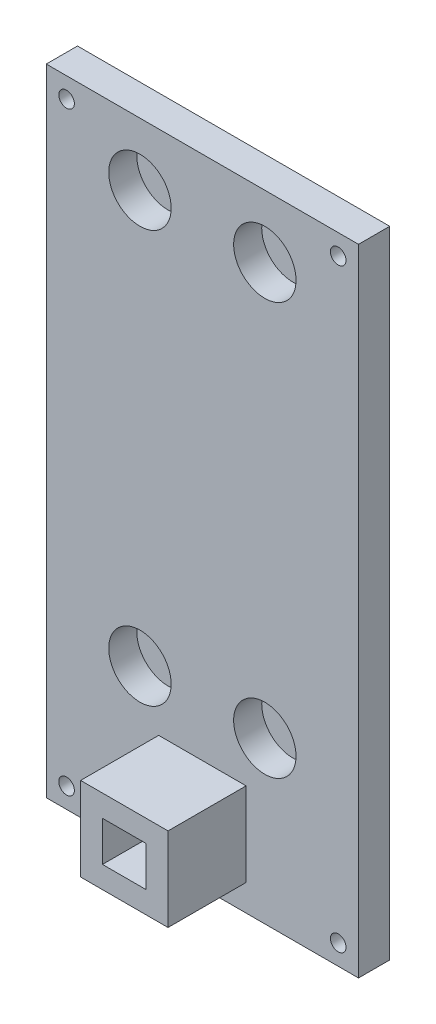
ISO-10303-21;
HEADER;
FILE_DESCRIPTION(('STEP AP214'),'2;1');
FILE_NAME('part.step','',(''),(''),'','','');
FILE_SCHEMA(('AUTOMOTIVE_DESIGN { 1 0 10303 214 1 1 1 1 }'));
ENDSEC;
DATA;
#1=APPLICATION_CONTEXT('core data for automotive mechanical design processes');
#2=APPLICATION_PROTOCOL_DEFINITION('international standard','automotive_design',2000,#1);
#3=PRODUCT_CONTEXT('',#1,'mechanical');
#4=PRODUCT('Part','Part','',(#3));
#5=PRODUCT_RELATED_PRODUCT_CATEGORY('part','',(#4));
#6=PRODUCT_DEFINITION_FORMATION('','',#4);
#7=PRODUCT_DEFINITION_CONTEXT('part definition',#1,'design');
#8=PRODUCT_DEFINITION('design','',#6,#7);
#9=PRODUCT_DEFINITION_SHAPE('','',#8);
#10=(LENGTH_UNIT() NAMED_UNIT(*) SI_UNIT(.MILLI.,.METRE.));
#11=(NAMED_UNIT(*) PLANE_ANGLE_UNIT() SI_UNIT($,.RADIAN.));
#12=(NAMED_UNIT(*) SI_UNIT($,.STERADIAN.) SOLID_ANGLE_UNIT());
#13=UNCERTAINTY_MEASURE_WITH_UNIT(LENGTH_MEASURE(1.E-05),#10,'distance_accuracy_value','');
#14=(GEOMETRIC_REPRESENTATION_CONTEXT(3) GLOBAL_UNCERTAINTY_ASSIGNED_CONTEXT((#13)) GLOBAL_UNIT_ASSIGNED_CONTEXT((#10,
#11,#12)) REPRESENTATION_CONTEXT('',''));
#15=CARTESIAN_POINT('',(0.,0.,0.));
#16=DIRECTION('',(0.,0.,1.));
#17=DIRECTION('',(1.,0.,0.));
#18=AXIS2_PLACEMENT_3D('',#15,#16,#17);
#19=CARTESIAN_POINT('',(0.,0.,10.));
#20=DIRECTION('',(0.,0.,1.));
#21=DIRECTION('',(1.,0.,0.));
#22=AXIS2_PLACEMENT_3D('',#19,#20,#21);
#23=PLANE('',#22);
#24=CARTESIAN_POINT('',(93.5,243.5,10.));
#25=DIRECTION('',(0.,0.,1.));
#26=DIRECTION('',(1.,0.,0.));
#27=AXIS2_PLACEMENT_3D('',#24,#25,#26);
#28=CIRCLE('',#27,2.50000000000001);
#29=CARTESIAN_POINT('',(96.,243.5,10.));
#30=VERTEX_POINT('',#29);
#31=EDGE_CURVE('E643',#30,#30,#28,.T.);
#32=ORIENTED_EDGE('',*,*,#31,.F.);
#33=EDGE_LOOP('',(#32));
#34=FACE_BOUND('',#33,.T.);
#35=CARTESIAN_POINT('',(6.49999999999999,53.,10.));
#36=DIRECTION('',(0.,0.,1.));
#37=DIRECTION('',(1.,0.,0.));
#38=AXIS2_PLACEMENT_3D('',#35,#36,#37);
#39=CIRCLE('',#38,2.5);
#40=CARTESIAN_POINT('',(8.99999999999999,53.,10.));
#41=VERTEX_POINT('',#40);
#42=EDGE_CURVE('E651',#41,#41,#39,.T.);
#43=ORIENTED_EDGE('',*,*,#42,.F.);
#44=EDGE_LOOP('',(#43));
#45=FACE_BOUND('',#44,.T.);
#46=CARTESIAN_POINT('',(93.5,53.,10.));
#47=DIRECTION('',(0.,0.,1.));
#48=DIRECTION('',(1.,0.,0.));
#49=AXIS2_PLACEMENT_3D('',#46,#47,#48);
#50=CIRCLE('',#49,2.50000000000001);
#51=CARTESIAN_POINT('',(96.,53.,10.));
#52=VERTEX_POINT('',#51);
#53=EDGE_CURVE('E659',#52,#52,#50,.T.);
#54=ORIENTED_EDGE('',*,*,#53,.F.);
#55=EDGE_LOOP('',(#54));
#56=FACE_BOUND('',#55,.T.);
#57=CARTESIAN_POINT('',(6.49999999999999,243.5,10.));
#58=DIRECTION('',(0.,0.,1.));
#59=DIRECTION('',(1.,0.,0.));
#60=AXIS2_PLACEMENT_3D('',#57,#58,#59);
#61=CIRCLE('',#60,2.5);
#62=CARTESIAN_POINT('',(8.99999999999999,243.5,10.));
#63=VERTEX_POINT('',#62);
#64=EDGE_CURVE('E645',#63,#63,#61,.T.);
#65=ORIENTED_EDGE('',*,*,#64,.F.);
#66=EDGE_LOOP('',(#65));
#67=FACE_BOUND('',#66,.T.);
#68=DIRECTION('',(-1.,0.,0.));
#69=VECTOR('',#68,1.);
#70=CARTESIAN_POINT('',(0.,46.5,10.));
#71=LINE('',#70,#69);
#72=CARTESIAN_POINT('',(100.,46.5,10.));
#73=VERTEX_POINT('',#72);
#74=CARTESIAN_POINT('',(0.,46.5,10.));
#75=VERTEX_POINT('',#74);
#76=EDGE_CURVE('E170',#73,#75,#71,.T.);
#77=ORIENTED_EDGE('',*,*,#76,.F.);
#78=DIRECTION('',(0.,1.,0.));
#79=VECTOR('',#78,1.);
#80=CARTESIAN_POINT('',(100.,0.,10.));
#81=LINE('',#80,#79);
#82=CARTESIAN_POINT('',(100.,250.,10.));
#83=VERTEX_POINT('',#82);
#84=EDGE_CURVE('E195',#73,#83,#81,.T.);
#85=ORIENTED_EDGE('',*,*,#84,.T.);
#86=DIRECTION('',(-1.,0.,0.));
#87=VECTOR('',#86,1.);
#88=CARTESIAN_POINT('',(100.,250.,10.));
#89=LINE('',#88,#87);
#90=CARTESIAN_POINT('',(0.,250.,10.));
#91=VERTEX_POINT('',#90);
#92=EDGE_CURVE('E192',#83,#91,#89,.T.);
#93=ORIENTED_EDGE('',*,*,#92,.T.);
#94=DIRECTION('',(0.,-1.,0.));
#95=VECTOR('',#94,1.);
#96=CARTESIAN_POINT('',(0.,250.,10.));
#97=LINE('',#96,#95);
#98=EDGE_CURVE('E184',#91,#75,#97,.T.);
#99=ORIENTED_EDGE('',*,*,#98,.T.);
#100=EDGE_LOOP('',(#77,#85,#93,#99));
#101=FACE_BOUND('',#100,.T.);
#102=CARTESIAN_POINT('',(30.,98.,10.));
#103=DIRECTION('',(0.,0.,1.));
#104=DIRECTION('',(1.,0.,0.));
#105=AXIS2_PLACEMENT_3D('',#102,#103,#104);
#106=CIRCLE('',#105,9.99999999999999);
#107=CARTESIAN_POINT('',(40.,98.,10.));
#108=VERTEX_POINT('',#107);
#109=EDGE_CURVE('E204',#108,#108,#106,.T.);
#110=ORIENTED_EDGE('',*,*,#109,.F.);
#111=EDGE_LOOP('',(#110));
#112=FACE_BOUND('',#111,.T.);
#113=CARTESIAN_POINT('',(30.,230.,10.));
#114=DIRECTION('',(0.,0.,1.));
#115=DIRECTION('',(1.,0.,0.));
#116=AXIS2_PLACEMENT_3D('',#113,#114,#115);
#117=CIRCLE('',#116,10.);
#118=CARTESIAN_POINT('',(40.,230.,10.));
#119=VERTEX_POINT('',#118);
#120=EDGE_CURVE('E356',#119,#119,#117,.T.);
#121=ORIENTED_EDGE('',*,*,#120,.F.);
#122=EDGE_LOOP('',(#121));
#123=FACE_BOUND('',#122,.T.);
#124=CARTESIAN_POINT('',(70.,230.,10.));
#125=DIRECTION('',(0.,0.,1.));
#126=DIRECTION('',(-1.,0.,0.));
#127=AXIS2_PLACEMENT_3D('',#124,#125,#126);
#128=CIRCLE('',#127,10.);
#129=CARTESIAN_POINT('',(60.,230.,10.));
#130=VERTEX_POINT('',#129);
#131=EDGE_CURVE('E364',#130,#130,#128,.T.);
#132=ORIENTED_EDGE('',*,*,#131,.F.);
#133=EDGE_LOOP('',(#132));
#134=FACE_BOUND('',#133,.T.);
#135=CARTESIAN_POINT('',(70.,98.,10.));
#136=DIRECTION('',(0.,0.,1.));
#137=DIRECTION('',(-1.,0.,0.));
#138=AXIS2_PLACEMENT_3D('',#135,#136,#137);
#139=CIRCLE('',#138,9.99999999999999);
#140=CARTESIAN_POINT('',(60.,98.,10.));
#141=VERTEX_POINT('',#140);
#142=EDGE_CURVE('E372',#141,#141,#139,.T.);
#143=ORIENTED_EDGE('',*,*,#142,.F.);
#144=EDGE_LOOP('',(#143));
#145=FACE_BOUND('',#144,.T.);
#146=DIRECTION('',(1.,0.,0.));
#147=VECTOR('',#146,1.);
#148=CARTESIAN_POINT('',(64.,55.,10.));
#149=LINE('',#148,#147);
#150=CARTESIAN_POINT('',(36.,55.,10.));
#151=VERTEX_POINT('',#150);
#152=CARTESIAN_POINT('',(64.,55.,10.));
#153=VERTEX_POINT('',#152);
#154=EDGE_CURVE('E333',#151,#153,#149,.T.);
#155=ORIENTED_EDGE('',*,*,#154,.F.);
#156=DIRECTION('',(0.,-1.,0.));
#157=VECTOR('',#156,1.);
#158=CARTESIAN_POINT('',(36.,55.,10.));
#159=LINE('',#158,#157);
#160=CARTESIAN_POINT('',(36.,81.8,10.));
#161=VERTEX_POINT('',#160);
#162=EDGE_CURVE('E314',#161,#151,#159,.T.);
#163=ORIENTED_EDGE('',*,*,#162,.F.);
#164=DIRECTION('',(-1.,0.,0.));
#165=VECTOR('',#164,1.);
#166=CARTESIAN_POINT('',(36.,81.8,10.));
#167=LINE('',#166,#165);
#168=CARTESIAN_POINT('',(64.,81.8,10.));
#169=VERTEX_POINT('',#168);
#170=EDGE_CURVE('E320',#169,#161,#167,.T.);
#171=ORIENTED_EDGE('',*,*,#170,.F.);
#172=DIRECTION('',(0.,1.,0.));
#173=VECTOR('',#172,1.);
#174=CARTESIAN_POINT('',(64.,55.,10.));
#175=LINE('',#174,#173);
#176=EDGE_CURVE('E336',#153,#169,#175,.T.);
#177=ORIENTED_EDGE('',*,*,#176,.F.);
#178=EDGE_LOOP('',(#155,#163,#171,#177));
#179=FACE_BOUND('',#178,.T.);
#180=ADVANCED_FACE('F46',(#34,#45,#56,#67,#101,#112,#123,#134,#145,#179),#23,.T.);
#181=CARTESIAN_POINT('',(0.,250.,10.));
#182=DIRECTION('',(1.,0.,0.));
#183=DIRECTION('',(0.,1.,0.));
#184=AXIS2_PLACEMENT_3D('',#181,#182,#183);
#185=PLANE('',#184);
#186=DIRECTION('',(0.,-1.,0.));
#187=VECTOR('',#186,1.);
#188=CARTESIAN_POINT('',(0.,250.,0.));
#189=LINE('',#188,#187);
#190=CARTESIAN_POINT('',(0.,66.9,0.));
#191=VERTEX_POINT('',#190);
#192=CARTESIAN_POINT('',(0.,46.5,0.));
#193=VERTEX_POINT('',#192);
#194=EDGE_CURVE('E187',#191,#193,#189,.T.);
#195=ORIENTED_EDGE('',*,*,#194,.T.);
#196=DIRECTION('',(0.,0.,1.));
#197=VECTOR('',#196,1.);
#198=CARTESIAN_POINT('',(0.,46.5,-2.));
#199=LINE('',#198,#197);
#200=EDGE_CURVE('E62',#193,#75,#199,.T.);
#201=ORIENTED_EDGE('',*,*,#200,.T.);
#202=ORIENTED_EDGE('',*,*,#98,.F.);
#203=DIRECTION('',(0.,0.,-1.));
#204=VECTOR('',#203,1.);
#205=CARTESIAN_POINT('',(0.,250.,10.));
#206=LINE('',#205,#204);
#207=CARTESIAN_POINT('',(0.,250.,0.));
#208=VERTEX_POINT('',#207);
#209=EDGE_CURVE('E209',#91,#208,#206,.T.);
#210=ORIENTED_EDGE('',*,*,#209,.T.);
#211=CARTESIAN_POINT('',(0.,69.9,0.));
#212=VERTEX_POINT('',#211);
#213=EDGE_CURVE('E210',#208,#212,#189,.T.);
#214=ORIENTED_EDGE('',*,*,#213,.T.);
#215=DIRECTION('',(0.,0.,-1.));
#216=VECTOR('',#215,1.);
#217=CARTESIAN_POINT('',(0.,69.9,2.));
#218=LINE('',#217,#216);
#219=CARTESIAN_POINT('',(0.,69.9,2.));
#220=VERTEX_POINT('',#219);
#221=EDGE_CURVE('E233',#220,#212,#218,.T.);
#222=ORIENTED_EDGE('',*,*,#221,.F.);
#223=DIRECTION('',(0.,1.,0.));
#224=VECTOR('',#223,1.);
#225=CARTESIAN_POINT('',(0.,69.9,2.));
#226=LINE('',#225,#224);
#227=CARTESIAN_POINT('',(0.,66.9,2.));
#228=VERTEX_POINT('',#227);
#229=EDGE_CURVE('E234',#228,#220,#226,.T.);
#230=ORIENTED_EDGE('',*,*,#229,.F.);
#231=DIRECTION('',(0.,0.,-1.));
#232=VECTOR('',#231,1.);
#233=CARTESIAN_POINT('',(0.,66.9,2.));
#234=LINE('',#233,#232);
#235=EDGE_CURVE('E238',#228,#191,#234,.T.);
#236=ORIENTED_EDGE('',*,*,#235,.T.);
#237=EDGE_LOOP('',(#195,#201,#202,#210,#214,#222,#230,#236));
#238=FACE_BOUND('',#237,.T.);
#239=ADVANCED_FACE('F48',(#238),#185,.F.);
#240=CARTESIAN_POINT('',(100.,0.,10.));
#241=DIRECTION('',(-1.,0.,0.));
#242=DIRECTION('',(0.,0.,1.));
#243=AXIS2_PLACEMENT_3D('',#240,#241,#242);
#244=PLANE('',#243);
#245=ORIENTED_EDGE('',*,*,#84,.F.);
#246=DIRECTION('',(0.,0.,1.));
#247=VECTOR('',#246,1.);
#248=CARTESIAN_POINT('',(100.,46.5,-2.));
#249=LINE('',#248,#247);
#250=CARTESIAN_POINT('',(100.,46.5,0.));
#251=VERTEX_POINT('',#250);
#252=EDGE_CURVE('E173',#251,#73,#249,.T.);
#253=ORIENTED_EDGE('',*,*,#252,.F.);
#254=DIRECTION('',(0.,1.,0.));
#255=VECTOR('',#254,1.);
#256=CARTESIAN_POINT('',(100.,0.,0.));
#257=LINE('',#256,#255);
#258=CARTESIAN_POINT('',(100.,250.,0.));
#259=VERTEX_POINT('',#258);
#260=EDGE_CURVE('E201',#251,#259,#257,.T.);
#261=ORIENTED_EDGE('',*,*,#260,.T.);
#262=DIRECTION('',(0.,0.,-1.));
#263=VECTOR('',#262,1.);
#264=CARTESIAN_POINT('',(100.,250.,10.));
#265=LINE('',#264,#263);
#266=EDGE_CURVE('E55',#83,#259,#265,.T.);
#267=ORIENTED_EDGE('',*,*,#266,.F.);
#268=EDGE_LOOP('',(#245,#253,#261,#267));
#269=FACE_BOUND('',#268,.T.);
#270=ADVANCED_FACE('F477',(#269),#244,.F.);
#271=CARTESIAN_POINT('',(100.,250.,10.));
#272=DIRECTION('',(0.,-1.,0.));
#273=DIRECTION('',(0.,0.,-1.));
#274=AXIS2_PLACEMENT_3D('',#271,#272,#273);
#275=PLANE('',#274);
#276=DIRECTION('',(-1.,0.,0.));
#277=VECTOR('',#276,1.);
#278=CARTESIAN_POINT('',(100.,250.,0.));
#279=LINE('',#278,#277);
#280=EDGE_CURVE('E196',#259,#208,#279,.T.);
#281=ORIENTED_EDGE('',*,*,#280,.T.);
#282=ORIENTED_EDGE('',*,*,#209,.F.);
#283=ORIENTED_EDGE('',*,*,#92,.F.);
#284=ORIENTED_EDGE('',*,*,#266,.T.);
#285=EDGE_LOOP('',(#281,#282,#283,#284));
#286=FACE_BOUND('',#285,.T.);
#287=ADVANCED_FACE('F222',(#286),#275,.F.);
#288=CARTESIAN_POINT('',(0.,0.,0.));
#289=DIRECTION('',(0.,0.,1.));
#290=DIRECTION('',(1.,0.,0.));
#291=AXIS2_PLACEMENT_3D('',#288,#289,#290);
#292=PLANE('',#291);
#293=CARTESIAN_POINT('',(93.5,243.5,0.));
#294=DIRECTION('',(0.,0.,1.));
#295=DIRECTION('',(1.,0.,0.));
#296=AXIS2_PLACEMENT_3D('',#293,#294,#295);
#297=CIRCLE('',#296,2.50000000000001);
#298=CARTESIAN_POINT('',(96.,243.5,0.));
#299=VERTEX_POINT('',#298);
#300=EDGE_CURVE('E640',#299,#299,#297,.F.);
#301=ORIENTED_EDGE('',*,*,#300,.F.);
#302=EDGE_LOOP('',(#301));
#303=FACE_BOUND('',#302,.T.);
#304=CARTESIAN_POINT('',(6.49999999999999,53.,0.));
#305=DIRECTION('',(0.,0.,1.));
#306=DIRECTION('',(1.,0.,0.));
#307=AXIS2_PLACEMENT_3D('',#304,#305,#306);
#308=CIRCLE('',#307,2.5);
#309=CARTESIAN_POINT('',(8.99999999999999,53.,0.));
#310=VERTEX_POINT('',#309);
#311=EDGE_CURVE('E655',#310,#310,#308,.F.);
#312=ORIENTED_EDGE('',*,*,#311,.F.);
#313=EDGE_LOOP('',(#312));
#314=FACE_BOUND('',#313,.T.);
#315=CARTESIAN_POINT('',(93.5,53.,0.));
#316=DIRECTION('',(0.,0.,1.));
#317=DIRECTION('',(1.,0.,0.));
#318=AXIS2_PLACEMENT_3D('',#315,#316,#317);
#319=CIRCLE('',#318,2.50000000000001);
#320=CARTESIAN_POINT('',(96.,53.,0.));
#321=VERTEX_POINT('',#320);
#322=EDGE_CURVE('E677',#321,#321,#319,.F.);
#323=ORIENTED_EDGE('',*,*,#322,.F.);
#324=EDGE_LOOP('',(#323));
#325=FACE_BOUND('',#324,.T.);
#326=CARTESIAN_POINT('',(6.49999999999999,243.5,0.));
#327=DIRECTION('',(0.,0.,1.));
#328=DIRECTION('',(1.,0.,0.));
#329=AXIS2_PLACEMENT_3D('',#326,#327,#328);
#330=CIRCLE('',#329,2.5);
#331=CARTESIAN_POINT('',(8.99999999999999,243.5,0.));
#332=VERTEX_POINT('',#331);
#333=EDGE_CURVE('E178',#332,#332,#330,.F.);
#334=ORIENTED_EDGE('',*,*,#333,.F.);
#335=EDGE_LOOP('',(#334));
#336=FACE_BOUND('',#335,.T.);
#337=ORIENTED_EDGE('',*,*,#260,.F.);
#338=DIRECTION('',(-1.,0.,0.));
#339=VECTOR('',#338,1.);
#340=CARTESIAN_POINT('',(0.,46.5,0.));
#341=LINE('',#340,#339);
#342=EDGE_CURVE('E11',#251,#193,#341,.T.);
#343=ORIENTED_EDGE('',*,*,#342,.T.);
#344=ORIENTED_EDGE('',*,*,#194,.F.);
#345=DIRECTION('',(-1.,0.,0.));
#346=VECTOR('',#345,1.);
#347=CARTESIAN_POINT('',(43.,66.9,0.));
#348=LINE('',#347,#346);
#349=CARTESIAN_POINT('',(43.,66.9,0.));
#350=VERTEX_POINT('',#349);
#351=EDGE_CURVE('E484',#350,#191,#348,.T.);
#352=ORIENTED_EDGE('',*,*,#351,.F.);
#353=DIRECTION('',(0.,-1.,0.));
#354=VECTOR('',#353,1.);
#355=CARTESIAN_POINT('',(43.,62.,0.));
#356=LINE('',#355,#354);
#357=CARTESIAN_POINT('',(43.,62.,0.));
#358=VERTEX_POINT('',#357);
#359=EDGE_CURVE('E255',#350,#358,#356,.T.);
#360=ORIENTED_EDGE('',*,*,#359,.T.);
#361=DIRECTION('',(1.,0.,0.));
#362=VECTOR('',#361,1.);
#363=CARTESIAN_POINT('',(45.,62.,0.));
#364=LINE('',#363,#362);
#365=CARTESIAN_POINT('',(45.,62.,0.));
#366=VERTEX_POINT('',#365);
#367=EDGE_CURVE('E254',#358,#366,#364,.T.);
#368=ORIENTED_EDGE('',*,*,#367,.T.);
#369=DIRECTION('',(0.,1.,0.));
#370=VECTOR('',#369,1.);
#371=CARTESIAN_POINT('',(45.,74.8,0.));
#372=LINE('',#371,#370);
#373=CARTESIAN_POINT('',(45.,74.8,0.));
#374=VERTEX_POINT('',#373);
#375=EDGE_CURVE('E259',#366,#374,#372,.T.);
#376=ORIENTED_EDGE('',*,*,#375,.T.);
#377=DIRECTION('',(-1.,0.,0.));
#378=VECTOR('',#377,1.);
#379=CARTESIAN_POINT('',(43.,74.8,0.));
#380=LINE('',#379,#378);
#381=CARTESIAN_POINT('',(43.,74.8,0.));
#382=VERTEX_POINT('',#381);
#383=EDGE_CURVE('E263',#374,#382,#380,.T.);
#384=ORIENTED_EDGE('',*,*,#383,.T.);
#385=CARTESIAN_POINT('',(43.,69.9,0.));
#386=VERTEX_POINT('',#385);
#387=EDGE_CURVE('E251',#382,#386,#356,.T.);
#388=ORIENTED_EDGE('',*,*,#387,.T.);
#389=DIRECTION('',(1.,0.,0.));
#390=VECTOR('',#389,1.);
#391=CARTESIAN_POINT('',(43.,69.9,0.));
#392=LINE('',#391,#390);
#393=EDGE_CURVE('E230',#212,#386,#392,.T.);
#394=ORIENTED_EDGE('',*,*,#393,.F.);
#395=ORIENTED_EDGE('',*,*,#213,.F.);
#396=ORIENTED_EDGE('',*,*,#280,.F.);
#397=EDGE_LOOP('',(#337,#343,#344,#352,#360,#368,#376,#384,#388,#394,#395,#396));
#398=FACE_BOUND('',#397,.T.);
#399=ADVANCED_FACE('F227',(#303,#314,#325,#336,#398),#292,.F.);
#400=CARTESIAN_POINT('',(30.,98.,1.));
#401=DIRECTION('',(0.,0.,1.));
#402=DIRECTION('',(1.,0.,0.));
#403=AXIS2_PLACEMENT_3D('',#400,#401,#402);
#404=CYLINDRICAL_SURFACE('',#403,9.99999999999999);
#405=CARTESIAN_POINT('',(30.,98.,1.));
#406=DIRECTION('',(0.,0.,1.));
#407=DIRECTION('',(1.,0.,0.));
#408=AXIS2_PLACEMENT_3D('',#405,#406,#407);
#409=CIRCLE('',#408,9.99999999999999);
#410=CARTESIAN_POINT('',(40.,98.,1.));
#411=VERTEX_POINT('',#410);
#412=EDGE_CURVE('E378',#411,#411,#409,.T.);
#413=ORIENTED_EDGE('',*,*,#412,.F.);
#414=EDGE_LOOP('',(#413));
#415=FACE_BOUND('',#414,.T.);
#416=ORIENTED_EDGE('',*,*,#109,.T.);
#417=EDGE_LOOP('',(#416));
#418=FACE_BOUND('',#417,.T.);
#419=ADVANCED_FACE('F388',(#415,#418),#404,.F.);
#420=CARTESIAN_POINT('',(30.,98.,1.));
#421=DIRECTION('',(0.,0.,1.));
#422=DIRECTION('',(1.,0.,0.));
#423=AXIS2_PLACEMENT_3D('',#420,#421,#422);
#424=PLANE('',#423);
#425=ORIENTED_EDGE('',*,*,#412,.T.);
#426=EDGE_LOOP('',(#425));
#427=FACE_BOUND('',#426,.T.);
#428=ADVANCED_FACE('F443',(#427),#424,.T.);
#429=CARTESIAN_POINT('',(30.,230.,1.));
#430=DIRECTION('',(0.,0.,1.));
#431=DIRECTION('',(1.,0.,0.));
#432=AXIS2_PLACEMENT_3D('',#429,#430,#431);
#433=CYLINDRICAL_SURFACE('',#432,10.);
#434=CARTESIAN_POINT('',(30.,230.,1.));
#435=DIRECTION('',(0.,0.,1.));
#436=DIRECTION('',(1.,0.,0.));
#437=AXIS2_PLACEMENT_3D('',#434,#435,#436);
#438=CIRCLE('',#437,10.);
#439=CARTESIAN_POINT('',(40.,230.,1.));
#440=VERTEX_POINT('',#439);
#441=EDGE_CURVE('E360',#440,#440,#438,.T.);
#442=ORIENTED_EDGE('',*,*,#441,.F.);
#443=EDGE_LOOP('',(#442));
#444=FACE_BOUND('',#443,.T.);
#445=ORIENTED_EDGE('',*,*,#120,.T.);
#446=EDGE_LOOP('',(#445));
#447=FACE_BOUND('',#446,.T.);
#448=ADVANCED_FACE('F439',(#444,#447),#433,.F.);
#449=CARTESIAN_POINT('',(30.,230.,1.));
#450=DIRECTION('',(0.,0.,1.));
#451=DIRECTION('',(1.,0.,0.));
#452=AXIS2_PLACEMENT_3D('',#449,#450,#451);
#453=PLANE('',#452);
#454=ORIENTED_EDGE('',*,*,#441,.T.);
#455=EDGE_LOOP('',(#454));
#456=FACE_BOUND('',#455,.T.);
#457=ADVANCED_FACE('F442',(#456),#453,.T.);
#458=CARTESIAN_POINT('',(70.,230.,1.));
#459=DIRECTION('',(0.,0.,1.));
#460=DIRECTION('',(1.,0.,0.));
#461=AXIS2_PLACEMENT_3D('',#458,#459,#460);
#462=CYLINDRICAL_SURFACE('',#461,10.);
#463=CARTESIAN_POINT('',(70.,230.,1.));
#464=DIRECTION('',(0.,0.,1.));
#465=DIRECTION('',(-1.,0.,0.));
#466=AXIS2_PLACEMENT_3D('',#463,#464,#465);
#467=CIRCLE('',#466,10.);
#468=CARTESIAN_POINT('',(60.,230.,1.));
#469=VERTEX_POINT('',#468);
#470=EDGE_CURVE('E368',#469,#469,#467,.T.);
#471=ORIENTED_EDGE('',*,*,#470,.F.);
#472=EDGE_LOOP('',(#471));
#473=FACE_BOUND('',#472,.T.);
#474=ORIENTED_EDGE('',*,*,#131,.T.);
#475=EDGE_LOOP('',(#474));
#476=FACE_BOUND('',#475,.T.);
#477=ADVANCED_FACE('F447',(#473,#476),#462,.F.);
#478=CARTESIAN_POINT('',(70.,230.,1.));
#479=DIRECTION('',(0.,0.,-1.));
#480=DIRECTION('',(-1.,0.,0.));
#481=AXIS2_PLACEMENT_3D('',#478,#479,#480);
#482=PLANE('',#481);
#483=ORIENTED_EDGE('',*,*,#470,.T.);
#484=EDGE_LOOP('',(#483));
#485=FACE_BOUND('',#484,.T.);
#486=ADVANCED_FACE('F451',(#485),#482,.F.);
#487=CARTESIAN_POINT('',(70.,98.,1.));
#488=DIRECTION('',(0.,0.,1.));
#489=DIRECTION('',(1.,0.,0.));
#490=AXIS2_PLACEMENT_3D('',#487,#488,#489);
#491=CYLINDRICAL_SURFACE('',#490,9.99999999999999);
#492=CARTESIAN_POINT('',(70.,98.,1.));
#493=DIRECTION('',(0.,0.,1.));
#494=DIRECTION('',(-1.,0.,0.));
#495=AXIS2_PLACEMENT_3D('',#492,#493,#494);
#496=CIRCLE('',#495,9.99999999999999);
#497=CARTESIAN_POINT('',(60.,98.,1.));
#498=VERTEX_POINT('',#497);
#499=EDGE_CURVE('E355',#498,#498,#496,.T.);
#500=ORIENTED_EDGE('',*,*,#499,.F.);
#501=EDGE_LOOP('',(#500));
#502=FACE_BOUND('',#501,.T.);
#503=ORIENTED_EDGE('',*,*,#142,.T.);
#504=EDGE_LOOP('',(#503));
#505=FACE_BOUND('',#504,.T.);
#506=ADVANCED_FACE('F455',(#502,#505),#491,.F.);
#507=CARTESIAN_POINT('',(70.,98.,1.));
#508=DIRECTION('',(0.,0.,-1.));
#509=DIRECTION('',(-1.,0.,0.));
#510=AXIS2_PLACEMENT_3D('',#507,#508,#509);
#511=PLANE('',#510);
#512=ORIENTED_EDGE('',*,*,#499,.T.);
#513=EDGE_LOOP('',(#512));
#514=FACE_BOUND('',#513,.T.);
#515=ADVANCED_FACE('F459',(#514),#511,.F.);
#516=CARTESIAN_POINT('',(0.,0.,35.));
#517=DIRECTION('',(0.,0.,-1.));
#518=DIRECTION('',(-1.,0.,0.));
#519=AXIS2_PLACEMENT_3D('',#516,#517,#518);
#520=PLANE('',#519);
#521=DIRECTION('',(0.,-1.,0.));
#522=VECTOR('',#521,1.);
#523=CARTESIAN_POINT('',(36.,55.,35.));
#524=LINE('',#523,#522);
#525=CARTESIAN_POINT('',(36.,81.8,35.));
#526=VERTEX_POINT('',#525);
#527=CARTESIAN_POINT('',(36.,55.,35.));
#528=VERTEX_POINT('',#527);
#529=EDGE_CURVE('E315',#526,#528,#524,.T.);
#530=ORIENTED_EDGE('',*,*,#529,.T.);
#531=DIRECTION('',(1.,0.,0.));
#532=VECTOR('',#531,1.);
#533=CARTESIAN_POINT('',(64.,55.,35.));
#534=LINE('',#533,#532);
#535=CARTESIAN_POINT('',(64.,55.,35.));
#536=VERTEX_POINT('',#535);
#537=EDGE_CURVE('E319',#528,#536,#534,.T.);
#538=ORIENTED_EDGE('',*,*,#537,.T.);
#539=DIRECTION('',(0.,1.,0.));
#540=VECTOR('',#539,1.);
#541=CARTESIAN_POINT('',(64.,55.,35.));
#542=LINE('',#541,#540);
#543=CARTESIAN_POINT('',(64.,81.8,35.));
#544=VERTEX_POINT('',#543);
#545=EDGE_CURVE('E323',#536,#544,#542,.T.);
#546=ORIENTED_EDGE('',*,*,#545,.T.);
#547=DIRECTION('',(-1.,0.,0.));
#548=VECTOR('',#547,1.);
#549=CARTESIAN_POINT('',(36.,81.8,35.));
#550=LINE('',#549,#548);
#551=EDGE_CURVE('E326',#544,#526,#550,.T.);
#552=ORIENTED_EDGE('',*,*,#551,.T.);
#553=EDGE_LOOP('',(#530,#538,#546,#552));
#554=FACE_BOUND('',#553,.T.);
#555=DIRECTION('',(0.,1.,0.));
#556=VECTOR('',#555,1.);
#557=CARTESIAN_POINT('',(57.,62.,35.));
#558=LINE('',#557,#556);
#559=CARTESIAN_POINT('',(57.,62.,35.));
#560=VERTEX_POINT('',#559);
#561=CARTESIAN_POINT('',(57.,74.8,35.));
#562=VERTEX_POINT('',#561);
#563=EDGE_CURVE('E280',#560,#562,#558,.T.);
#564=ORIENTED_EDGE('',*,*,#563,.F.);
#565=DIRECTION('',(1.,0.,0.));
#566=VECTOR('',#565,1.);
#567=CARTESIAN_POINT('',(50.,62.,35.));
#568=LINE('',#567,#566);
#569=CARTESIAN_POINT('',(43.,62.,35.));
#570=VERTEX_POINT('',#569);
#571=EDGE_CURVE('E277',#570,#560,#568,.T.);
#572=ORIENTED_EDGE('',*,*,#571,.F.);
#573=DIRECTION('',(0.,-1.,0.));
#574=VECTOR('',#573,1.);
#575=CARTESIAN_POINT('',(43.,62.,35.));
#576=LINE('',#575,#574);
#577=CARTESIAN_POINT('',(43.,74.8,35.));
#578=VERTEX_POINT('',#577);
#579=EDGE_CURVE('E287',#578,#570,#576,.T.);
#580=ORIENTED_EDGE('',*,*,#579,.F.);
#581=DIRECTION('',(-1.,0.,0.));
#582=VECTOR('',#581,1.);
#583=CARTESIAN_POINT('',(43.,74.8,35.));
#584=LINE('',#583,#582);
#585=EDGE_CURVE('E284',#562,#578,#584,.T.);
#586=ORIENTED_EDGE('',*,*,#585,.F.);
#587=EDGE_LOOP('',(#564,#572,#580,#586));
#588=FACE_BOUND('',#587,.T.);
#589=ADVANCED_FACE('F414',(#554,#588),#520,.F.);
#590=CARTESIAN_POINT('',(36.,55.,35.));
#591=DIRECTION('',(1.,0.,0.));
#592=DIRECTION('',(0.,0.,-1.));
#593=AXIS2_PLACEMENT_3D('',#590,#591,#592);
#594=PLANE('',#593);
#595=ORIENTED_EDGE('',*,*,#162,.T.);
#596=DIRECTION('',(0.,0.,-1.));
#597=VECTOR('',#596,1.);
#598=CARTESIAN_POINT('',(36.,55.,35.));
#599=LINE('',#598,#597);
#600=EDGE_CURVE('E352',#528,#151,#599,.T.);
#601=ORIENTED_EDGE('',*,*,#600,.F.);
#602=ORIENTED_EDGE('',*,*,#529,.F.);
#603=DIRECTION('',(0.,0.,-1.));
#604=VECTOR('',#603,1.);
#605=CARTESIAN_POINT('',(36.,81.8,35.));
#606=LINE('',#605,#604);
#607=EDGE_CURVE('E329',#526,#161,#606,.T.);
#608=ORIENTED_EDGE('',*,*,#607,.T.);
#609=EDGE_LOOP('',(#595,#601,#602,#608));
#610=FACE_BOUND('',#609,.T.);
#611=ADVANCED_FACE('F419',(#610),#594,.F.);
#612=CARTESIAN_POINT('',(64.,55.,35.));
#613=DIRECTION('',(0.,1.,0.));
#614=DIRECTION('',(0.,0.,1.));
#615=AXIS2_PLACEMENT_3D('',#612,#613,#614);
#616=PLANE('',#615);
#617=ORIENTED_EDGE('',*,*,#154,.T.);
#618=DIRECTION('',(0.,0.,-1.));
#619=VECTOR('',#618,1.);
#620=CARTESIAN_POINT('',(64.,55.,35.));
#621=LINE('',#620,#619);
#622=EDGE_CURVE('E348',#536,#153,#621,.T.);
#623=ORIENTED_EDGE('',*,*,#622,.F.);
#624=ORIENTED_EDGE('',*,*,#537,.F.);
#625=ORIENTED_EDGE('',*,*,#600,.T.);
#626=EDGE_LOOP('',(#617,#623,#624,#625));
#627=FACE_BOUND('',#626,.T.);
#628=ADVANCED_FACE('F406',(#627),#616,.F.);
#629=CARTESIAN_POINT('',(64.,55.,35.));
#630=DIRECTION('',(-1.,0.,0.));
#631=DIRECTION('',(0.,0.,1.));
#632=AXIS2_PLACEMENT_3D('',#629,#630,#631);
#633=PLANE('',#632);
#634=ORIENTED_EDGE('',*,*,#176,.T.);
#635=DIRECTION('',(0.,0.,-1.));
#636=VECTOR('',#635,1.);
#637=CARTESIAN_POINT('',(64.,81.8,35.));
#638=LINE('',#637,#636);
#639=EDGE_CURVE('E345',#544,#169,#638,.T.);
#640=ORIENTED_EDGE('',*,*,#639,.F.);
#641=ORIENTED_EDGE('',*,*,#545,.F.);
#642=ORIENTED_EDGE('',*,*,#622,.T.);
#643=EDGE_LOOP('',(#634,#640,#641,#642));
#644=FACE_BOUND('',#643,.T.);
#645=ADVANCED_FACE('F410',(#644),#633,.F.);
#646=CARTESIAN_POINT('',(36.,81.8,35.));
#647=DIRECTION('',(0.,-1.,0.));
#648=DIRECTION('',(0.,0.,-1.));
#649=AXIS2_PLACEMENT_3D('',#646,#647,#648);
#650=PLANE('',#649);
#651=ORIENTED_EDGE('',*,*,#170,.T.);
#652=ORIENTED_EDGE('',*,*,#607,.F.);
#653=ORIENTED_EDGE('',*,*,#551,.F.);
#654=ORIENTED_EDGE('',*,*,#639,.T.);
#655=EDGE_LOOP('',(#651,#652,#653,#654));
#656=FACE_BOUND('',#655,.T.);
#657=ADVANCED_FACE('F421',(#656),#650,.F.);
#658=CARTESIAN_POINT('',(57.,62.,35.));
#659=DIRECTION('',(-1.,0.,0.));
#660=DIRECTION('',(0.,0.,1.));
#661=AXIS2_PLACEMENT_3D('',#658,#659,#660);
#662=PLANE('',#661);
#663=DIRECTION('',(0.,1.,0.));
#664=VECTOR('',#663,1.);
#665=CARTESIAN_POINT('',(57.,62.,10.));
#666=LINE('',#665,#664);
#667=CARTESIAN_POINT('',(57.,62.,10.));
#668=VERTEX_POINT('',#667);
#669=CARTESIAN_POINT('',(57.,74.8,10.));
#670=VERTEX_POINT('',#669);
#671=EDGE_CURVE('E274',#668,#670,#666,.T.);
#672=ORIENTED_EDGE('',*,*,#671,.F.);
#673=DIRECTION('',(0.,0.,-1.));
#674=VECTOR('',#673,1.);
#675=CARTESIAN_POINT('',(57.,62.,35.));
#676=LINE('',#675,#674);
#677=EDGE_CURVE('E310',#560,#668,#676,.T.);
#678=ORIENTED_EDGE('',*,*,#677,.F.);
#679=ORIENTED_EDGE('',*,*,#563,.T.);
#680=DIRECTION('',(0.,0.,-1.));
#681=VECTOR('',#680,1.);
#682=CARTESIAN_POINT('',(57.,74.8,35.));
#683=LINE('',#682,#681);
#684=EDGE_CURVE('E306',#562,#670,#683,.T.);
#685=ORIENTED_EDGE('',*,*,#684,.T.);
#686=EDGE_LOOP('',(#672,#678,#679,#685));
#687=FACE_BOUND('',#686,.T.);
#688=ADVANCED_FACE('F423',(#687),#662,.T.);
#689=CARTESIAN_POINT('',(43.,74.8,35.));
#690=DIRECTION('',(0.,-1.,0.));
#691=DIRECTION('',(0.,0.,-1.));
#692=AXIS2_PLACEMENT_3D('',#689,#690,#691);
#693=PLANE('',#692);
#694=DIRECTION('',(-1.,0.,0.));
#695=VECTOR('',#694,1.);
#696=CARTESIAN_POINT('',(43.,74.8,10.));
#697=LINE('',#696,#695);
#698=CARTESIAN_POINT('',(45.,74.8,10.));
#699=VERTEX_POINT('',#698);
#700=EDGE_CURVE('E294',#670,#699,#697,.T.);
#701=ORIENTED_EDGE('',*,*,#700,.F.);
#702=ORIENTED_EDGE('',*,*,#684,.F.);
#703=ORIENTED_EDGE('',*,*,#585,.T.);
#704=DIRECTION('',(0.,0.,-1.));
#705=VECTOR('',#704,1.);
#706=CARTESIAN_POINT('',(43.,74.8,35.));
#707=LINE('',#706,#705);
#708=EDGE_CURVE('E303',#578,#382,#707,.T.);
#709=ORIENTED_EDGE('',*,*,#708,.T.);
#710=ORIENTED_EDGE('',*,*,#383,.F.);
#711=DIRECTION('',(0.,0.,1.));
#712=VECTOR('',#711,1.);
#713=CARTESIAN_POINT('',(45.,74.8,0.));
#714=LINE('',#713,#712);
#715=EDGE_CURVE('E271',#374,#699,#714,.T.);
#716=ORIENTED_EDGE('',*,*,#715,.T.);
#717=EDGE_LOOP('',(#701,#702,#703,#709,#710,#716));
#718=FACE_BOUND('',#717,.T.);
#719=ADVANCED_FACE('F429',(#718),#693,.T.);
#720=CARTESIAN_POINT('',(43.,62.,35.));
#721=DIRECTION('',(1.,0.,0.));
#722=DIRECTION('',(0.,0.,-1.));
#723=AXIS2_PLACEMENT_3D('',#720,#721,#722);
#724=PLANE('',#723);
#725=DIRECTION('',(0.,0.,-1.));
#726=VECTOR('',#725,1.);
#727=CARTESIAN_POINT('',(43.,69.9,2.));
#728=LINE('',#727,#726);
#729=CARTESIAN_POINT('',(43.,69.9,2.));
#730=VERTEX_POINT('',#729);
#731=EDGE_CURVE('E237',#730,#386,#728,.T.);
#732=ORIENTED_EDGE('',*,*,#731,.T.);
#733=ORIENTED_EDGE('',*,*,#387,.F.);
#734=ORIENTED_EDGE('',*,*,#708,.F.);
#735=ORIENTED_EDGE('',*,*,#579,.T.);
#736=DIRECTION('',(0.,0.,-1.));
#737=VECTOR('',#736,1.);
#738=CARTESIAN_POINT('',(43.,62.,35.));
#739=LINE('',#738,#737);
#740=EDGE_CURVE('E291',#570,#358,#739,.T.);
#741=ORIENTED_EDGE('',*,*,#740,.T.);
#742=ORIENTED_EDGE('',*,*,#359,.F.);
#743=DIRECTION('',(0.,0.,-1.));
#744=VECTOR('',#743,1.);
#745=CARTESIAN_POINT('',(43.,66.9,2.));
#746=LINE('',#745,#744);
#747=CARTESIAN_POINT('',(43.,66.9,2.));
#748=VERTEX_POINT('',#747);
#749=EDGE_CURVE('E245',#748,#350,#746,.T.);
#750=ORIENTED_EDGE('',*,*,#749,.F.);
#751=DIRECTION('',(0.,-1.,0.));
#752=VECTOR('',#751,1.);
#753=CARTESIAN_POINT('',(43.,69.9,2.));
#754=LINE('',#753,#752);
#755=EDGE_CURVE('E490',#730,#748,#754,.T.);
#756=ORIENTED_EDGE('',*,*,#755,.F.);
#757=EDGE_LOOP('',(#732,#733,#734,#735,#741,#742,#750,#756));
#758=FACE_BOUND('',#757,.T.);
#759=ADVANCED_FACE('F505',(#758),#724,.T.);
#760=CARTESIAN_POINT('',(50.,62.,35.));
#761=DIRECTION('',(0.,1.,0.));
#762=DIRECTION('',(0.,0.,1.));
#763=AXIS2_PLACEMENT_3D('',#760,#761,#762);
#764=PLANE('',#763);
#765=DIRECTION('',(1.,0.,0.));
#766=VECTOR('',#765,1.);
#767=CARTESIAN_POINT('',(50.,62.,10.));
#768=LINE('',#767,#766);
#769=CARTESIAN_POINT('',(45.,62.,10.));
#770=VERTEX_POINT('',#769);
#771=EDGE_CURVE('E281',#770,#668,#768,.T.);
#772=ORIENTED_EDGE('',*,*,#771,.F.);
#773=DIRECTION('',(0.,0.,1.));
#774=VECTOR('',#773,1.);
#775=CARTESIAN_POINT('',(45.,62.,0.));
#776=LINE('',#775,#774);
#777=EDGE_CURVE('E267',#366,#770,#776,.T.);
#778=ORIENTED_EDGE('',*,*,#777,.F.);
#779=ORIENTED_EDGE('',*,*,#367,.F.);
#780=ORIENTED_EDGE('',*,*,#740,.F.);
#781=ORIENTED_EDGE('',*,*,#571,.T.);
#782=ORIENTED_EDGE('',*,*,#677,.T.);
#783=EDGE_LOOP('',(#772,#778,#779,#780,#781,#782));
#784=FACE_BOUND('',#783,.T.);
#785=ADVANCED_FACE('F471',(#784),#764,.T.);
#786=DIRECTION('',(0.,1.,0.));
#787=VECTOR('',#786,1.);
#788=CARTESIAN_POINT('',(45.,74.8,10.));
#789=LINE('',#788,#787);
#790=EDGE_CURVE('E243',#770,#699,#789,.T.);
#791=ORIENTED_EDGE('',*,*,#790,.F.);
#792=ORIENTED_EDGE('',*,*,#771,.T.);
#793=ORIENTED_EDGE('',*,*,#671,.T.);
#794=ORIENTED_EDGE('',*,*,#700,.T.);
#795=EDGE_LOOP('',(#791,#792,#793,#794));
#796=FACE_BOUND('',#795,.T.);
#797=ADVANCED_FACE('F393',(#796),#23,.T.);
#798=CARTESIAN_POINT('',(45.,74.8,0.));
#799=DIRECTION('',(1.,0.,0.));
#800=DIRECTION('',(0.,0.,-1.));
#801=AXIS2_PLACEMENT_3D('',#798,#799,#800);
#802=PLANE('',#801);
#803=ORIENTED_EDGE('',*,*,#790,.T.);
#804=ORIENTED_EDGE('',*,*,#715,.F.);
#805=ORIENTED_EDGE('',*,*,#375,.F.);
#806=ORIENTED_EDGE('',*,*,#777,.T.);
#807=EDGE_LOOP('',(#803,#804,#805,#806));
#808=FACE_BOUND('',#807,.T.);
#809=ADVANCED_FACE('F470',(#808),#802,.F.);
#810=CARTESIAN_POINT('',(43.,69.9,2.));
#811=DIRECTION('',(0.,1.,0.));
#812=DIRECTION('',(0.,0.,1.));
#813=AXIS2_PLACEMENT_3D('',#810,#811,#812);
#814=PLANE('',#813);
#815=ORIENTED_EDGE('',*,*,#393,.T.);
#816=ORIENTED_EDGE('',*,*,#731,.F.);
#817=DIRECTION('',(1.,0.,0.));
#818=VECTOR('',#817,1.);
#819=CARTESIAN_POINT('',(43.,69.9,2.));
#820=LINE('',#819,#818);
#821=EDGE_CURVE('E69',#220,#730,#820,.T.);
#822=ORIENTED_EDGE('',*,*,#821,.F.);
#823=ORIENTED_EDGE('',*,*,#221,.T.);
#824=EDGE_LOOP('',(#815,#816,#822,#823));
#825=FACE_BOUND('',#824,.T.);
#826=ADVANCED_FACE('F501',(#825),#814,.F.);
#827=CARTESIAN_POINT('',(43.,66.9,2.));
#828=DIRECTION('',(0.,-1.,0.));
#829=DIRECTION('',(0.,0.,-1.));
#830=AXIS2_PLACEMENT_3D('',#827,#828,#829);
#831=PLANE('',#830);
#832=ORIENTED_EDGE('',*,*,#351,.T.);
#833=ORIENTED_EDGE('',*,*,#235,.F.);
#834=DIRECTION('',(-1.,0.,0.));
#835=VECTOR('',#834,1.);
#836=CARTESIAN_POINT('',(43.,66.9,2.));
#837=LINE('',#836,#835);
#838=EDGE_CURVE('E493',#748,#228,#837,.T.);
#839=ORIENTED_EDGE('',*,*,#838,.F.);
#840=ORIENTED_EDGE('',*,*,#749,.T.);
#841=EDGE_LOOP('',(#832,#833,#839,#840));
#842=FACE_BOUND('',#841,.T.);
#843=ADVANCED_FACE('F528',(#842),#831,.F.);
#844=CARTESIAN_POINT('',(0.,0.,2.));
#845=DIRECTION('',(0.,0.,-1.));
#846=DIRECTION('',(-1.,0.,0.));
#847=AXIS2_PLACEMENT_3D('',#844,#845,#846);
#848=PLANE('',#847);
#849=ORIENTED_EDGE('',*,*,#755,.T.);
#850=ORIENTED_EDGE('',*,*,#838,.T.);
#851=ORIENTED_EDGE('',*,*,#229,.T.);
#852=ORIENTED_EDGE('',*,*,#821,.T.);
#853=EDGE_LOOP('',(#849,#850,#851,#852));
#854=FACE_BOUND('',#853,.T.);
#855=ADVANCED_FACE('F529',(#854),#848,.T.);
#856=CARTESIAN_POINT('',(0.,46.5,-2.));
#857=DIRECTION('',(0.,1.,0.));
#858=DIRECTION('',(-1.,0.,0.));
#859=AXIS2_PLACEMENT_3D('',#856,#857,#858);
#860=PLANE('',#859);
#861=ORIENTED_EDGE('',*,*,#252,.T.);
#862=ORIENTED_EDGE('',*,*,#76,.T.);
#863=ORIENTED_EDGE('',*,*,#200,.F.);
#864=ORIENTED_EDGE('',*,*,#342,.F.);
#865=EDGE_LOOP('',(#861,#862,#863,#864));
#866=FACE_BOUND('',#865,.T.);
#867=ADVANCED_FACE('F171',(#866),#860,.F.);
#868=CARTESIAN_POINT('',(6.49999999999999,243.5,-7.07106781186551));
#869=DIRECTION('',(0.,0.,1.));
#870=DIRECTION('',(1.,0.,0.));
#871=AXIS2_PLACEMENT_3D('',#868,#869,#870);
#872=CYLINDRICAL_SURFACE('',#871,2.5);
#873=ORIENTED_EDGE('',*,*,#333,.T.);
#874=EDGE_LOOP('',(#873));
#875=FACE_BOUND('',#874,.T.);
#876=ORIENTED_EDGE('',*,*,#64,.T.);
#877=EDGE_LOOP('',(#876));
#878=FACE_BOUND('',#877,.T.);
#879=ADVANCED_FACE('F535',(#875,#878),#872,.F.);
#880=CARTESIAN_POINT('',(93.5,53.,-7.07106781186551));
#881=DIRECTION('',(0.,0.,1.));
#882=DIRECTION('',(1.,0.,0.));
#883=AXIS2_PLACEMENT_3D('',#880,#881,#882);
#884=CYLINDRICAL_SURFACE('',#883,2.50000000000001);
#885=ORIENTED_EDGE('',*,*,#322,.T.);
#886=EDGE_LOOP('',(#885));
#887=FACE_BOUND('',#886,.T.);
#888=ORIENTED_EDGE('',*,*,#53,.T.);
#889=EDGE_LOOP('',(#888));
#890=FACE_BOUND('',#889,.T.);
#891=ADVANCED_FACE('F605',(#887,#890),#884,.F.);
#892=CARTESIAN_POINT('',(6.49999999999999,53.,-7.07106781186551));
#893=DIRECTION('',(0.,0.,1.));
#894=DIRECTION('',(1.,0.,0.));
#895=AXIS2_PLACEMENT_3D('',#892,#893,#894);
#896=CYLINDRICAL_SURFACE('',#895,2.5);
#897=ORIENTED_EDGE('',*,*,#311,.T.);
#898=EDGE_LOOP('',(#897));
#899=FACE_BOUND('',#898,.T.);
#900=ORIENTED_EDGE('',*,*,#42,.T.);
#901=EDGE_LOOP('',(#900));
#902=FACE_BOUND('',#901,.T.);
#903=ADVANCED_FACE('F614',(#899,#902),#896,.F.);
#904=CARTESIAN_POINT('',(93.5,243.5,-7.07106781186551));
#905=DIRECTION('',(0.,0.,1.));
#906=DIRECTION('',(1.,0.,0.));
#907=AXIS2_PLACEMENT_3D('',#904,#905,#906);
#908=CYLINDRICAL_SURFACE('',#907,2.50000000000001);
#909=ORIENTED_EDGE('',*,*,#300,.T.);
#910=EDGE_LOOP('',(#909));
#911=FACE_BOUND('',#910,.T.);
#912=ORIENTED_EDGE('',*,*,#31,.T.);
#913=EDGE_LOOP('',(#912));
#914=FACE_BOUND('',#913,.T.);
#915=ADVANCED_FACE('F624',(#911,#914),#908,.F.);
#916=CLOSED_SHELL('',(#180,#239,#270,#287,#399,#419,#428,#448,#457,#477,#486,#506,#515,#589,
#611,#628,#645,#657,#688,#719,#759,#785,#797,#809,#826,#843,#855,#867,#879,#891,#903,#915));
#917=MANIFOLD_SOLID_BREP('B2',#916);
#918=ADVANCED_BREP_SHAPE_REPRESENTATION('',(#18,#917),#14);
#919=SHAPE_DEFINITION_REPRESENTATION(#9,#918);
ENDSEC;
END-ISO-10303-21;
